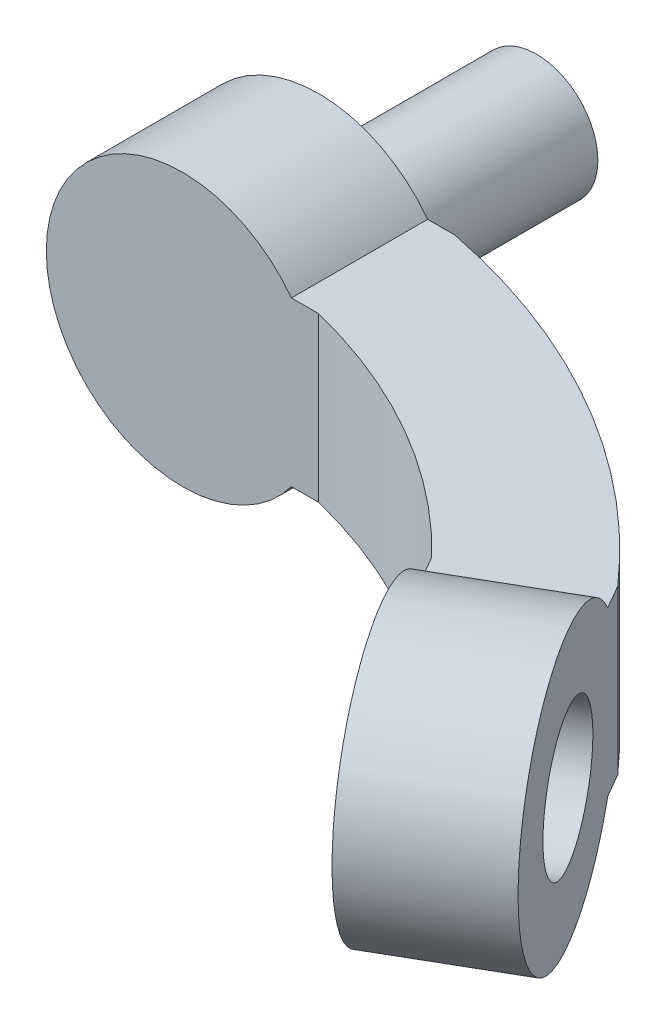
ISO-10303-21;
HEADER;
FILE_DESCRIPTION(('STEP AP214'),'2;1');
FILE_NAME('part.step','',(''),(''),'','','');
FILE_SCHEMA(('AUTOMOTIVE_DESIGN { 1 0 10303 214 1 1 1 1 }'));
ENDSEC;
DATA;
#1=APPLICATION_CONTEXT('core data for automotive mechanical design processes');
#2=APPLICATION_PROTOCOL_DEFINITION('international standard','automotive_design',2000,#1);
#3=PRODUCT_CONTEXT('',#1,'mechanical');
#4=PRODUCT('Part','Part','',(#3));
#5=PRODUCT_RELATED_PRODUCT_CATEGORY('part','',(#4));
#6=PRODUCT_DEFINITION_FORMATION('','',#4);
#7=PRODUCT_DEFINITION_CONTEXT('part definition',#1,'design');
#8=PRODUCT_DEFINITION('design','',#6,#7);
#9=PRODUCT_DEFINITION_SHAPE('','',#8);
#10=(LENGTH_UNIT() NAMED_UNIT(*) SI_UNIT(.MILLI.,.METRE.));
#11=(NAMED_UNIT(*) PLANE_ANGLE_UNIT() SI_UNIT($,.RADIAN.));
#12=(NAMED_UNIT(*) SI_UNIT($,.STERADIAN.) SOLID_ANGLE_UNIT());
#13=UNCERTAINTY_MEASURE_WITH_UNIT(LENGTH_MEASURE(1.E-05),#10,'distance_accuracy_value','');
#14=(GEOMETRIC_REPRESENTATION_CONTEXT(3) GLOBAL_UNCERTAINTY_ASSIGNED_CONTEXT((#13)) GLOBAL_UNIT_ASSIGNED_CONTEXT((#10,
#11,#12)) REPRESENTATION_CONTEXT('',''));
#15=CARTESIAN_POINT('',(0.,0.,0.));
#16=DIRECTION('',(0.,0.,1.));
#17=DIRECTION('',(1.,0.,0.));
#18=AXIS2_PLACEMENT_3D('',#15,#16,#17);
#19=CARTESIAN_POINT('',(0.,0.,5.));
#20=DIRECTION('',(0.,0.,-1.));
#21=DIRECTION('',(-1.,0.,0.));
#22=AXIS2_PLACEMENT_3D('',#19,#20,#21);
#23=CYLINDRICAL_SURFACE('',#22,5.);
#24=DIRECTION('',(0.,0.,-1.));
#25=VECTOR('',#24,1.);
#26=CARTESIAN_POINT('',(4.,-3.,5.));
#27=LINE('',#26,#25);
#28=CARTESIAN_POINT('',(4.,-3.,5.));
#29=VERTEX_POINT('',#28);
#30=CARTESIAN_POINT('',(4.,-3.,0.));
#31=VERTEX_POINT('',#30);
#32=EDGE_CURVE('E52',#29,#31,#27,.T.);
#33=ORIENTED_EDGE('',*,*,#32,.F.);
#34=CARTESIAN_POINT('',(0.,0.,5.));
#35=DIRECTION('',(0.,0.,1.));
#36=DIRECTION('',(1.,0.,0.));
#37=AXIS2_PLACEMENT_3D('',#34,#35,#36);
#38=CIRCLE('',#37,5.);
#39=CARTESIAN_POINT('',(4.,3.,5.));
#40=VERTEX_POINT('',#39);
#41=EDGE_CURVE('E11',#40,#29,#38,.T.);
#42=ORIENTED_EDGE('',*,*,#41,.F.);
#43=DIRECTION('',(0.,0.,-1.));
#44=VECTOR('',#43,1.);
#45=CARTESIAN_POINT('',(4.,3.,5.));
#46=LINE('',#45,#44);
#47=CARTESIAN_POINT('',(4.,3.,0.));
#48=VERTEX_POINT('',#47);
#49=EDGE_CURVE('E150',#48,#40,#46,.F.);
#50=ORIENTED_EDGE('',*,*,#49,.F.);
#51=CARTESIAN_POINT('',(0.,0.,0.));
#52=DIRECTION('',(0.,0.,1.));
#53=DIRECTION('',(1.,0.,0.));
#54=AXIS2_PLACEMENT_3D('',#51,#52,#53);
#55=CIRCLE('',#54,5.);
#56=EDGE_CURVE('E41',#48,#31,#55,.T.);
#57=ORIENTED_EDGE('',*,*,#56,.T.);
#58=EDGE_LOOP('',(#33,#42,#50,#57));
#59=FACE_BOUND('',#58,.T.);
#60=ADVANCED_FACE('F38',(#59),#23,.T.);
#61=CARTESIAN_POINT('',(0.,0.,5.));
#62=DIRECTION('',(0.,0.,1.));
#63=DIRECTION('',(1.,0.,0.));
#64=AXIS2_PLACEMENT_3D('',#61,#62,#63);
#65=PLANE('',#64);
#66=DIRECTION('',(1.,0.,0.));
#67=VECTOR('',#66,1.);
#68=CARTESIAN_POINT('',(2.,-3.,4.99999999999998));
#69=LINE('',#68,#67);
#70=CARTESIAN_POINT('',(4.9999999999999,-3.,4.99999999999998));
#71=VERTEX_POINT('',#70);
#72=EDGE_CURVE('E147',#29,#71,#69,.T.);
#73=ORIENTED_EDGE('',*,*,#72,.T.);
#74=DIRECTION('',(0.,1.,0.));
#75=VECTOR('',#74,1.);
#76=CARTESIAN_POINT('',(5.,-3.,4.99999999999998));
#77=LINE('',#76,#75);
#78=CARTESIAN_POINT('',(4.9999999999999,3.,4.99999999999998));
#79=VERTEX_POINT('',#78);
#80=EDGE_CURVE('E118',#71,#79,#77,.T.);
#81=ORIENTED_EDGE('',*,*,#80,.T.);
#82=DIRECTION('',(1.,0.,0.));
#83=VECTOR('',#82,1.);
#84=CARTESIAN_POINT('',(2.,3.,4.99999999999998));
#85=LINE('',#84,#83);
#86=EDGE_CURVE('E144',#40,#79,#85,.T.);
#87=ORIENTED_EDGE('',*,*,#86,.F.);
#88=ORIENTED_EDGE('',*,*,#41,.T.);
#89=EDGE_LOOP('',(#73,#81,#87,#88));
#90=FACE_BOUND('',#89,.T.);
#91=ADVANCED_FACE('F199',(#90),#65,.T.);
#92=CARTESIAN_POINT('',(0.,0.,0.));
#93=DIRECTION('',(0.,0.,1.));
#94=DIRECTION('',(1.,0.,0.));
#95=AXIS2_PLACEMENT_3D('',#92,#93,#94);
#96=PLANE('',#95);
#97=CARTESIAN_POINT('',(0.,0.,0.));
#98=DIRECTION('',(0.,0.,1.));
#99=DIRECTION('',(1.,0.,0.));
#100=AXIS2_PLACEMENT_3D('',#97,#98,#99);
#101=CIRCLE('',#100,2.25);
#102=CARTESIAN_POINT('',(2.25,0.,0.));
#103=VERTEX_POINT('',#102);
#104=EDGE_CURVE('E181',#103,#103,#101,.T.);
#105=ORIENTED_EDGE('',*,*,#104,.T.);
#106=EDGE_LOOP('',(#105));
#107=FACE_BOUND('',#106,.T.);
#108=ORIENTED_EDGE('',*,*,#56,.F.);
#109=DIRECTION('',(1.,0.,0.));
#110=VECTOR('',#109,1.);
#111=CARTESIAN_POINT('',(2.,3.,0.));
#112=LINE('',#111,#110);
#113=CARTESIAN_POINT('',(5.,3.,0.));
#114=VERTEX_POINT('',#113);
#115=EDGE_CURVE('E141',#48,#114,#112,.T.);
#116=ORIENTED_EDGE('',*,*,#115,.T.);
#117=DIRECTION('',(0.,-1.,0.));
#118=VECTOR('',#117,1.);
#119=CARTESIAN_POINT('',(5.,3.,0.));
#120=LINE('',#119,#118);
#121=CARTESIAN_POINT('',(5.,-3.,0.));
#122=VERTEX_POINT('',#121);
#123=EDGE_CURVE('E138',#114,#122,#120,.T.);
#124=ORIENTED_EDGE('',*,*,#123,.T.);
#125=DIRECTION('',(1.,0.,0.));
#126=VECTOR('',#125,1.);
#127=CARTESIAN_POINT('',(2.,-3.,0.));
#128=LINE('',#127,#126);
#129=EDGE_CURVE('E125',#31,#122,#128,.T.);
#130=ORIENTED_EDGE('',*,*,#129,.F.);
#131=EDGE_LOOP('',(#108,#116,#124,#130));
#132=FACE_BOUND('',#131,.T.);
#133=ADVANCED_FACE('F155',(#107,#132),#96,.F.);
#134=CARTESIAN_POINT('',(2.,-3.,0.));
#135=DIRECTION('',(0.,1.,0.));
#136=DIRECTION('',(0.,0.,1.));
#137=AXIS2_PLACEMENT_3D('',#134,#135,#136);
#138=PLANE('',#137);
#139=ORIENTED_EDGE('',*,*,#72,.F.);
#140=ORIENTED_EDGE('',*,*,#32,.T.);
#141=ORIENTED_EDGE('',*,*,#129,.T.);
#142=CARTESIAN_POINT('',(0.,-3.,25.));
#143=DIRECTION('',(0.,1.,0.));
#144=DIRECTION('',(0.,0.,1.));
#145=AXIS2_PLACEMENT_3D('',#142,#143,#144);
#146=CIRCLE('',#145,25.4950975679639);
#147=CARTESIAN_POINT('',(19.1506350946109,-3.,8.16987298107772));
#148=VERTEX_POINT('',#147);
#149=EDGE_CURVE('E115',#122,#148,#146,.F.);
#150=ORIENTED_EDGE('',*,*,#149,.T.);
#151=DIRECTION('',(-0.500000000000008,0.,-0.866025403784434));
#152=VECTOR('',#151,1.);
#153=CARTESIAN_POINT('',(20.6506350946109,-3.,10.767949192431));
#154=LINE('',#153,#152);
#155=CARTESIAN_POINT('',(19.6506350946109,-3.,9.03589838486222));
#156=VERTEX_POINT('',#155);
#157=EDGE_CURVE('E97',#156,#148,#154,.T.);
#158=ORIENTED_EDGE('',*,*,#157,.F.);
#159=DIRECTION('',(-0.866025403784438,0.,0.500000000000002));
#160=VECTOR('',#159,1.);
#161=CARTESIAN_POINT('',(-2.,-3.,21.5358983848623));
#162=LINE('',#161,#160);
#163=CARTESIAN_POINT('',(15.3205080756888,-3.,11.5358983848622));
#164=VERTEX_POINT('',#163);
#165=EDGE_CURVE('E109',#156,#164,#162,.T.);
#166=ORIENTED_EDGE('',*,*,#165,.T.);
#167=DIRECTION('',(-0.500000000000008,0.,-0.866025403784434));
#168=VECTOR('',#167,1.);
#169=CARTESIAN_POINT('',(16.3205080756887,-3.,13.2679491924311));
#170=LINE('',#169,#168);
#171=CARTESIAN_POINT('',(14.8205080756887,-3.,10.6698729810778));
#172=VERTEX_POINT('',#171);
#173=EDGE_CURVE('E108',#164,#172,#170,.T.);
#174=ORIENTED_EDGE('',*,*,#173,.T.);
#175=CARTESIAN_POINT('',(0.,-3.,25.));
#176=DIRECTION('',(0.,1.,0.));
#177=DIRECTION('',(0.,0.,1.));
#178=AXIS2_PLACEMENT_3D('',#175,#176,#177);
#179=CIRCLE('',#178,20.6155281280883);
#180=EDGE_CURVE('E126',#71,#172,#179,.F.);
#181=ORIENTED_EDGE('',*,*,#180,.F.);
#182=EDGE_LOOP('',(#139,#140,#141,#150,#158,#166,#174,#181));
#183=FACE_BOUND('',#182,.T.);
#184=ADVANCED_FACE('F123',(#183),#138,.F.);
#185=CARTESIAN_POINT('',(2.,3.,4.99999999999998));
#186=DIRECTION('',(0.,-1.,0.));
#187=DIRECTION('',(0.,0.,-1.));
#188=AXIS2_PLACEMENT_3D('',#185,#186,#187);
#189=PLANE('',#188);
#190=ORIENTED_EDGE('',*,*,#115,.F.);
#191=ORIENTED_EDGE('',*,*,#49,.T.);
#192=ORIENTED_EDGE('',*,*,#86,.T.);
#193=CARTESIAN_POINT('',(0.,3.,25.));
#194=DIRECTION('',(0.,1.,0.));
#195=DIRECTION('',(0.,0.,1.));
#196=AXIS2_PLACEMENT_3D('',#193,#194,#195);
#197=CIRCLE('',#196,20.6155281280883);
#198=CARTESIAN_POINT('',(14.8205080756887,3.,10.6698729810778));
#199=VERTEX_POINT('',#198);
#200=EDGE_CURVE('E127',#79,#199,#197,.F.);
#201=ORIENTED_EDGE('',*,*,#200,.T.);
#202=DIRECTION('',(-0.500000000000008,0.,-0.866025403784434));
#203=VECTOR('',#202,1.);
#204=CARTESIAN_POINT('',(16.3205080756887,3.,13.2679491924311));
#205=LINE('',#204,#203);
#206=CARTESIAN_POINT('',(15.3205080756888,3.,11.5358983848622));
#207=VERTEX_POINT('',#206);
#208=EDGE_CURVE('E160',#207,#199,#205,.T.);
#209=ORIENTED_EDGE('',*,*,#208,.F.);
#210=DIRECTION('',(-0.866025403784438,0.,0.500000000000002));
#211=VECTOR('',#210,1.);
#212=CARTESIAN_POINT('',(-2.,3.,21.5358983848623));
#213=LINE('',#212,#211);
#214=CARTESIAN_POINT('',(19.6506350946109,3.,9.03589838486222));
#215=VERTEX_POINT('',#214);
#216=EDGE_CURVE('E167',#215,#207,#213,.T.);
#217=ORIENTED_EDGE('',*,*,#216,.F.);
#218=DIRECTION('',(-0.500000000000008,0.,-0.866025403784434));
#219=VECTOR('',#218,1.);
#220=CARTESIAN_POINT('',(20.6506350946109,3.,10.767949192431));
#221=LINE('',#220,#219);
#222=CARTESIAN_POINT('',(19.1506350946109,3.,8.16987298107778));
#223=VERTEX_POINT('',#222);
#224=EDGE_CURVE('E159',#215,#223,#221,.T.);
#225=ORIENTED_EDGE('',*,*,#224,.T.);
#226=CARTESIAN_POINT('',(0.,3.,25.));
#227=DIRECTION('',(0.,1.,0.));
#228=DIRECTION('',(0.,0.,1.));
#229=AXIS2_PLACEMENT_3D('',#226,#227,#228);
#230=CIRCLE('',#229,25.4950975679639);
#231=EDGE_CURVE('E117',#114,#223,#230,.F.);
#232=ORIENTED_EDGE('',*,*,#231,.F.);
#233=EDGE_LOOP('',(#190,#191,#192,#201,#209,#217,#225,#232));
#234=FACE_BOUND('',#233,.T.);
#235=ADVANCED_FACE('F157',(#234),#189,.F.);
#236=CARTESIAN_POINT('',(0.,-3.,25.));
#237=DIRECTION('',(0.,1.,0.));
#238=DIRECTION('',(0.,0.,1.));
#239=AXIS2_PLACEMENT_3D('',#236,#237,#238);
#240=CYLINDRICAL_SURFACE('',#239,25.4950975679639);
#241=ORIENTED_EDGE('',*,*,#123,.F.);
#242=ORIENTED_EDGE('',*,*,#231,.T.);
#243=DIRECTION('',(0.,1.,0.));
#244=VECTOR('',#243,1.);
#245=CARTESIAN_POINT('',(19.1506350946109,-3.,8.16987298107778));
#246=LINE('',#245,#244);
#247=EDGE_CURVE('E101',#148,#223,#246,.T.);
#248=ORIENTED_EDGE('',*,*,#247,.F.);
#249=ORIENTED_EDGE('',*,*,#149,.F.);
#250=EDGE_LOOP('',(#241,#242,#248,#249));
#251=FACE_BOUND('',#250,.T.);
#252=ADVANCED_FACE('F114',(#251),#240,.T.);
#253=CARTESIAN_POINT('',(0.,-3.,25.));
#254=DIRECTION('',(0.,1.,0.));
#255=DIRECTION('',(0.,0.,1.));
#256=AXIS2_PLACEMENT_3D('',#253,#254,#255);
#257=CYLINDRICAL_SURFACE('',#256,20.6155281280883);
#258=DIRECTION('',(0.,1.,0.));
#259=VECTOR('',#258,1.);
#260=CARTESIAN_POINT('',(14.8205080756887,-3.,10.6698729810778));
#261=LINE('',#260,#259);
#262=EDGE_CURVE('E119',#172,#199,#261,.T.);
#263=ORIENTED_EDGE('',*,*,#262,.T.);
#264=ORIENTED_EDGE('',*,*,#200,.F.);
#265=ORIENTED_EDGE('',*,*,#80,.F.);
#266=ORIENTED_EDGE('',*,*,#180,.T.);
#267=EDGE_LOOP('',(#263,#264,#265,#266));
#268=FACE_BOUND('',#267,.T.);
#269=ADVANCED_FACE('F216',(#268),#257,.F.);
#270=CARTESIAN_POINT('',(20.6506350946109,-3.,10.767949192431));
#271=DIRECTION('',(-0.866025403784434,0.,0.500000000000008));
#272=DIRECTION('',(0.500000000000008,0.,0.866025403784434));
#273=AXIS2_PLACEMENT_3D('',#270,#271,#272);
#274=PLANE('',#273);
#275=CARTESIAN_POINT('',(21.650635094611,0.,12.5));
#276=DIRECTION('',(-0.866025403784434,0.,0.500000000000008));
#277=DIRECTION('',(0.500000000000008,0.,0.866025403784434));
#278=AXIS2_PLACEMENT_3D('',#275,#276,#277);
#279=CIRCLE('',#278,2.5);
#280=CARTESIAN_POINT('',(22.900635094611,0.,14.665063509461));
#281=VERTEX_POINT('',#280);
#282=EDGE_CURVE('E174',#281,#281,#279,.T.);
#283=ORIENTED_EDGE('',*,*,#282,.T.);
#284=EDGE_LOOP('',(#283));
#285=FACE_BOUND('',#284,.T.);
#286=CARTESIAN_POINT('',(21.6506350946109,0.,12.5));
#287=DIRECTION('',(-0.866025403784438,0.,0.500000000000002));
#288=DIRECTION('',(0.500000000000002,0.,0.866025403784438));
#289=AXIS2_PLACEMENT_3D('',#286,#287,#288);
#290=CIRCLE('',#289,5.);
#291=EDGE_CURVE('E104',#156,#215,#290,.T.);
#292=ORIENTED_EDGE('',*,*,#291,.F.);
#293=ORIENTED_EDGE('',*,*,#157,.T.);
#294=ORIENTED_EDGE('',*,*,#247,.T.);
#295=ORIENTED_EDGE('',*,*,#224,.F.);
#296=EDGE_LOOP('',(#292,#293,#294,#295));
#297=FACE_BOUND('',#296,.T.);
#298=ADVANCED_FACE('F99',(#285,#297),#274,.F.);
#299=CARTESIAN_POINT('',(16.3205080756887,3.,13.2679491924311));
#300=DIRECTION('',(0.866025403784434,0.,-0.500000000000008));
#301=DIRECTION('',(-0.500000000000008,0.,-0.866025403784434));
#302=AXIS2_PLACEMENT_3D('',#299,#300,#301);
#303=PLANE('',#302);
#304=CARTESIAN_POINT('',(17.3205080756888,0.,15.));
#305=DIRECTION('',(-0.866025403784434,0.,0.500000000000008));
#306=DIRECTION('',(0.500000000000008,0.,0.866025403784434));
#307=AXIS2_PLACEMENT_3D('',#304,#305,#306);
#308=CIRCLE('',#307,2.5);
#309=CARTESIAN_POINT('',(18.5705080756888,0.,17.1650635094611));
#310=VERTEX_POINT('',#309);
#311=EDGE_CURVE('E175',#310,#310,#308,.T.);
#312=ORIENTED_EDGE('',*,*,#311,.F.);
#313=EDGE_LOOP('',(#312));
#314=FACE_BOUND('',#313,.T.);
#315=ORIENTED_EDGE('',*,*,#173,.F.);
#316=CARTESIAN_POINT('',(17.3205080756887,0.,15.));
#317=DIRECTION('',(-0.866025403784438,0.,0.500000000000002));
#318=DIRECTION('',(0.500000000000002,0.,0.866025403784438));
#319=AXIS2_PLACEMENT_3D('',#316,#317,#318);
#320=CIRCLE('',#319,4.99999999999999);
#321=EDGE_CURVE('E171',#164,#207,#320,.T.);
#322=ORIENTED_EDGE('',*,*,#321,.T.);
#323=ORIENTED_EDGE('',*,*,#208,.T.);
#324=ORIENTED_EDGE('',*,*,#262,.F.);
#325=EDGE_LOOP('',(#315,#322,#323,#324));
#326=FACE_BOUND('',#325,.T.);
#327=ADVANCED_FACE('F222',(#314,#326),#303,.F.);
#328=CARTESIAN_POINT('',(0.,0.,25.));
#329=DIRECTION('',(-0.866025403784438,0.,0.500000000000002));
#330=DIRECTION('',(0.500000000000002,0.,0.866025403784438));
#331=AXIS2_PLACEMENT_3D('',#328,#329,#330);
#332=CYLINDRICAL_SURFACE('',#331,5.);
#333=ORIENTED_EDGE('',*,*,#165,.F.);
#334=ORIENTED_EDGE('',*,*,#291,.T.);
#335=ORIENTED_EDGE('',*,*,#216,.T.);
#336=ORIENTED_EDGE('',*,*,#321,.F.);
#337=EDGE_LOOP('',(#333,#334,#335,#336));
#338=FACE_BOUND('',#337,.T.);
#339=ADVANCED_FACE('F226',(#338),#332,.T.);
#340=CARTESIAN_POINT('',(21.650635094611,0.,12.5));
#341=DIRECTION('',(-0.866025403784434,0.,0.500000000000008));
#342=DIRECTION('',(0.500000000000008,0.,0.866025403784434));
#343=AXIS2_PLACEMENT_3D('',#340,#341,#342);
#344=CYLINDRICAL_SURFACE('',#343,2.5);
#345=ORIENTED_EDGE('',*,*,#282,.F.);
#346=EDGE_LOOP('',(#345));
#347=FACE_BOUND('',#346,.T.);
#348=ORIENTED_EDGE('',*,*,#311,.T.);
#349=EDGE_LOOP('',(#348));
#350=FACE_BOUND('',#349,.T.);
#351=ADVANCED_FACE('F196',(#347,#350),#344,.F.);
#352=CARTESIAN_POINT('',(0.,0.,-8.));
#353=DIRECTION('',(0.,0.,1.));
#354=DIRECTION('',(1.,0.,0.));
#355=AXIS2_PLACEMENT_3D('',#352,#353,#354);
#356=CYLINDRICAL_SURFACE('',#355,2.25);
#357=CARTESIAN_POINT('',(0.,0.,-8.));
#358=DIRECTION('',(0.,0.,1.));
#359=DIRECTION('',(1.,0.,0.));
#360=AXIS2_PLACEMENT_3D('',#357,#358,#359);
#361=CIRCLE('',#360,2.25);
#362=CARTESIAN_POINT('',(2.25,0.,-8.));
#363=VERTEX_POINT('',#362);
#364=EDGE_CURVE('E178',#363,#363,#361,.T.);
#365=ORIENTED_EDGE('',*,*,#364,.T.);
#366=EDGE_LOOP('',(#365));
#367=FACE_BOUND('',#366,.T.);
#368=ORIENTED_EDGE('',*,*,#104,.F.);
#369=EDGE_LOOP('',(#368));
#370=FACE_BOUND('',#369,.T.);
#371=ADVANCED_FACE('F187',(#367,#370),#356,.T.);
#372=CARTESIAN_POINT('',(0.,0.,-8.));
#373=DIRECTION('',(0.,0.,1.));
#374=DIRECTION('',(1.,0.,0.));
#375=AXIS2_PLACEMENT_3D('',#372,#373,#374);
#376=PLANE('',#375);
#377=ORIENTED_EDGE('',*,*,#364,.F.);
#378=EDGE_LOOP('',(#377));
#379=FACE_BOUND('',#378,.T.);
#380=ADVANCED_FACE('F190',(#379),#376,.F.);
#381=CLOSED_SHELL('',(#60,#91,#133,#184,#235,#252,#269,#298,#327,#339,#351,#371,#380));
#382=MANIFOLD_SOLID_BREP('B2',#381);
#383=ADVANCED_BREP_SHAPE_REPRESENTATION('',(#18,#382),#14);
#384=SHAPE_DEFINITION_REPRESENTATION(#9,#383);
ENDSEC;
END-ISO-10303-21;
